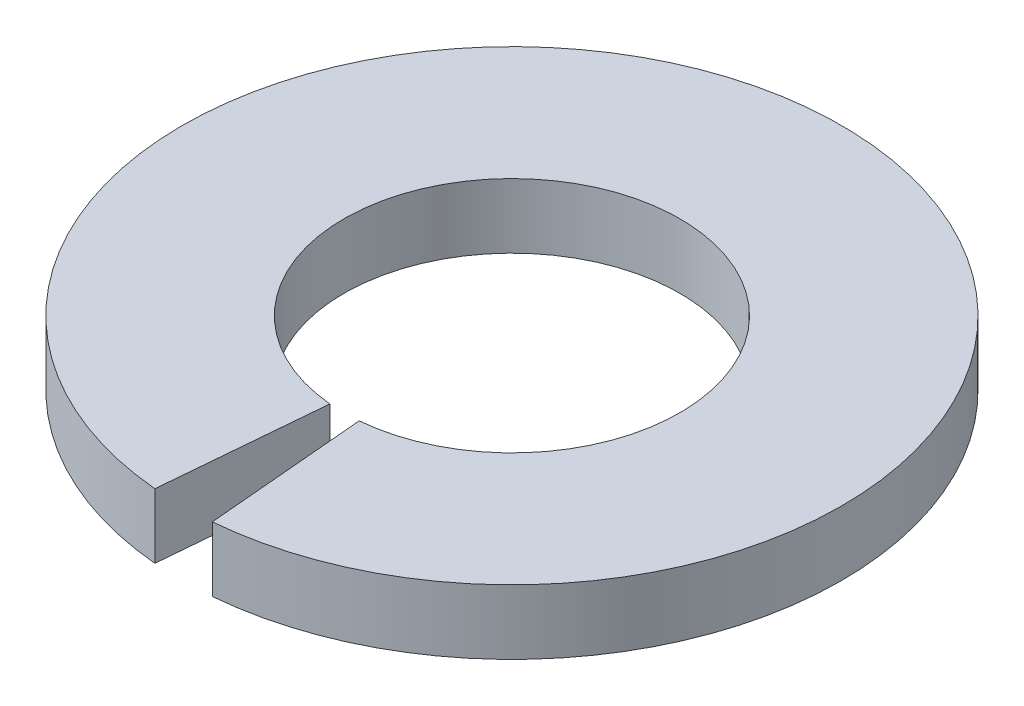
ISO-10303-21;
HEADER;
FILE_DESCRIPTION(('STEP AP214'),'2;1');
FILE_NAME('part.step','',(''),(''),'','','');
FILE_SCHEMA(('AUTOMOTIVE_DESIGN { 1 0 10303 214 1 1 1 1 }'));
ENDSEC;
DATA;
#1=APPLICATION_CONTEXT('core data for automotive mechanical design processes');
#2=APPLICATION_PROTOCOL_DEFINITION('international standard','automotive_design',2000,#1);
#3=PRODUCT_CONTEXT('',#1,'mechanical');
#4=PRODUCT('Part','Part','',(#3));
#5=PRODUCT_RELATED_PRODUCT_CATEGORY('part','',(#4));
#6=PRODUCT_DEFINITION_FORMATION('','',#4);
#7=PRODUCT_DEFINITION_CONTEXT('part definition',#1,'design');
#8=PRODUCT_DEFINITION('design','',#6,#7);
#9=PRODUCT_DEFINITION_SHAPE('','',#8);
#10=(LENGTH_UNIT() NAMED_UNIT(*) SI_UNIT(.MILLI.,.METRE.));
#11=(NAMED_UNIT(*) PLANE_ANGLE_UNIT() SI_UNIT($,.RADIAN.));
#12=(NAMED_UNIT(*) SI_UNIT($,.STERADIAN.) SOLID_ANGLE_UNIT());
#13=UNCERTAINTY_MEASURE_WITH_UNIT(LENGTH_MEASURE(1.E-05),#10,'distance_accuracy_value','');
#14=(GEOMETRIC_REPRESENTATION_CONTEXT(3) GLOBAL_UNCERTAINTY_ASSIGNED_CONTEXT((#13)) GLOBAL_UNIT_ASSIGNED_CONTEXT((#10,
#11,#12)) REPRESENTATION_CONTEXT('',''));
#15=CARTESIAN_POINT('',(0.,0.,0.));
#16=DIRECTION('',(0.,0.,1.));
#17=DIRECTION('',(1.,0.,0.));
#18=AXIS2_PLACEMENT_3D('',#15,#16,#17);
#19=CARTESIAN_POINT('',(0.,0.5,0.));
#20=DIRECTION('',(0.,1.,0.));
#21=DIRECTION('',(1.,0.,0.));
#22=AXIS2_PLACEMENT_3D('',#19,#20,#21);
#23=PLANE('',#22);
#24=CARTESIAN_POINT('',(0.,0.5,0.));
#25=DIRECTION('',(0.,-1.,0.));
#26=DIRECTION('',(-0.0871557427476639,0.,0.996194698091745));
#27=AXIS2_PLACEMENT_3D('',#24,#25,#26);
#28=CIRCLE('',#27,1.3);
#29=CARTESIAN_POINT('',(-0.113302465572,0.5,1.295053107519));
#30=VERTEX_POINT('',#29);
#31=CARTESIAN_POINT('',(0.113302465572,0.5,1.295053107519));
#32=VERTEX_POINT('',#31);
#33=EDGE_CURVE('E11',#30,#32,#28,.T.);
#34=ORIENTED_EDGE('',*,*,#33,.T.);
#35=DIRECTION('',(-0.087155742747664,0.,-0.996194698091745));
#36=VECTOR('',#35,1.);
#37=CARTESIAN_POINT('',(0.2222471440065,0.5,2.540296480134));
#38=LINE('',#37,#36);
#39=CARTESIAN_POINT('',(0.2222471440065,0.5,2.540296480134));
#40=VERTEX_POINT('',#39);
#41=EDGE_CURVE('E98',#40,#32,#38,.T.);
#42=ORIENTED_EDGE('',*,*,#41,.F.);
#43=CARTESIAN_POINT('',(0.,0.5,0.));
#44=DIRECTION('',(0.,1.,0.));
#45=DIRECTION('',(0.0871557427476639,0.,0.996194698091745));
#46=AXIS2_PLACEMENT_3D('',#43,#44,#45);
#47=CIRCLE('',#46,2.55);
#48=CARTESIAN_POINT('',(-0.2222471440065,0.5,2.540296480134));
#49=VERTEX_POINT('',#48);
#50=EDGE_CURVE('E103',#40,#49,#47,.T.);
#51=ORIENTED_EDGE('',*,*,#50,.T.);
#52=DIRECTION('',(-0.087155742747664,0.,0.996194698091745));
#53=VECTOR('',#52,1.);
#54=CARTESIAN_POINT('',(-0.113302465572,0.5,1.295053107519));
#55=LINE('',#54,#53);
#56=EDGE_CURVE('E21',#30,#49,#55,.T.);
#57=ORIENTED_EDGE('',*,*,#56,.F.);
#58=EDGE_LOOP('',(#34,#42,#51,#57));
#59=FACE_BOUND('',#58,.T.);
#60=ADVANCED_FACE('F17',(#59),#23,.T.);
#61=CARTESIAN_POINT('',(0.,0.,0.));
#62=DIRECTION('',(0.,1.,0.));
#63=DIRECTION('',(1.,0.,0.));
#64=AXIS2_PLACEMENT_3D('',#61,#62,#63);
#65=CYLINDRICAL_SURFACE('',#64,1.3);
#66=DIRECTION('',(0.,1.,0.));
#67=VECTOR('',#66,1.);
#68=CARTESIAN_POINT('',(-0.113302465572,0.,1.295053107519));
#69=LINE('',#68,#67);
#70=CARTESIAN_POINT('',(-0.113302465572,0.,1.295053107519));
#71=VERTEX_POINT('',#70);
#72=EDGE_CURVE('E66',#71,#30,#69,.T.);
#73=ORIENTED_EDGE('',*,*,#72,.F.);
#74=CARTESIAN_POINT('',(0.,0.,0.));
#75=DIRECTION('',(0.,1.,0.));
#76=DIRECTION('',(0.0871557427476639,0.,0.996194698091745));
#77=AXIS2_PLACEMENT_3D('',#74,#75,#76);
#78=CIRCLE('',#77,1.3);
#79=CARTESIAN_POINT('',(0.113302465572,0.,1.295053107519));
#80=VERTEX_POINT('',#79);
#81=EDGE_CURVE('E70',#80,#71,#78,.T.);
#82=ORIENTED_EDGE('',*,*,#81,.F.);
#83=DIRECTION('',(0.,1.,0.));
#84=VECTOR('',#83,1.);
#85=CARTESIAN_POINT('',(0.113302465572,0.,1.295053107519));
#86=LINE('',#85,#84);
#87=EDGE_CURVE('E28',#80,#32,#86,.T.);
#88=ORIENTED_EDGE('',*,*,#87,.T.);
#89=ORIENTED_EDGE('',*,*,#33,.F.);
#90=EDGE_LOOP('',(#73,#82,#88,#89));
#91=FACE_BOUND('',#90,.T.);
#92=ADVANCED_FACE('F68',(#91),#65,.F.);
#93=CARTESIAN_POINT('',(0.2222471440065,0.5,2.540296480134));
#94=DIRECTION('',(0.996194698091745,0.,-0.0871557427476639));
#95=DIRECTION('',(0.,-1.,0.));
#96=AXIS2_PLACEMENT_3D('',#93,#94,#95);
#97=PLANE('',#96);
#98=DIRECTION('',(0.,1.,0.));
#99=VECTOR('',#98,1.);
#100=CARTESIAN_POINT('',(0.2222471440065,0.,2.540296480134));
#101=LINE('',#100,#99);
#102=CARTESIAN_POINT('',(0.2222471440065,0.,2.540296480134));
#103=VERTEX_POINT('',#102);
#104=EDGE_CURVE('E99',#103,#40,#101,.T.);
#105=ORIENTED_EDGE('',*,*,#104,.T.);
#106=ORIENTED_EDGE('',*,*,#41,.T.);
#107=ORIENTED_EDGE('',*,*,#87,.F.);
#108=DIRECTION('',(-0.087155742747664,0.,-0.996194698091745));
#109=VECTOR('',#108,1.);
#110=CARTESIAN_POINT('',(0.2222471440065,0.,2.540296480134));
#111=LINE('',#110,#109);
#112=EDGE_CURVE('E87',#103,#80,#111,.T.);
#113=ORIENTED_EDGE('',*,*,#112,.F.);
#114=EDGE_LOOP('',(#105,#106,#107,#113));
#115=FACE_BOUND('',#114,.T.);
#116=ADVANCED_FACE('F116',(#115),#97,.F.);
#117=CARTESIAN_POINT('',(0.,0.,0.));
#118=DIRECTION('',(0.,1.,0.));
#119=DIRECTION('',(1.,0.,0.));
#120=AXIS2_PLACEMENT_3D('',#117,#118,#119);
#121=CYLINDRICAL_SURFACE('',#120,2.55);
#122=DIRECTION('',(0.,1.,0.));
#123=VECTOR('',#122,1.);
#124=CARTESIAN_POINT('',(-0.2222471440065,0.,2.540296480134));
#125=LINE('',#124,#123);
#126=CARTESIAN_POINT('',(-0.2222471440065,0.,2.540296480134));
#127=VERTEX_POINT('',#126);
#128=EDGE_CURVE('E80',#127,#49,#125,.T.);
#129=ORIENTED_EDGE('',*,*,#128,.T.);
#130=ORIENTED_EDGE('',*,*,#50,.F.);
#131=ORIENTED_EDGE('',*,*,#104,.F.);
#132=CARTESIAN_POINT('',(0.,0.,0.));
#133=DIRECTION('',(0.,-1.,0.));
#134=DIRECTION('',(-0.0871557427476639,0.,0.996194698091745));
#135=AXIS2_PLACEMENT_3D('',#132,#133,#134);
#136=CIRCLE('',#135,2.55);
#137=EDGE_CURVE('E93',#127,#103,#136,.T.);
#138=ORIENTED_EDGE('',*,*,#137,.F.);
#139=EDGE_LOOP('',(#129,#130,#131,#138));
#140=FACE_BOUND('',#139,.T.);
#141=ADVANCED_FACE('F112',(#140),#121,.T.);
#142=CARTESIAN_POINT('',(0.,0.5,0.));
#143=DIRECTION('',(-0.996194698091745,0.,-0.0871557427476639));
#144=DIRECTION('',(-0.0871557427476639,0.,0.996194698091745));
#145=AXIS2_PLACEMENT_3D('',#142,#143,#144);
#146=PLANE('',#145);
#147=ORIENTED_EDGE('',*,*,#72,.T.);
#148=ORIENTED_EDGE('',*,*,#56,.T.);
#149=ORIENTED_EDGE('',*,*,#128,.F.);
#150=DIRECTION('',(-0.087155742747664,0.,0.996194698091745));
#151=VECTOR('',#150,1.);
#152=CARTESIAN_POINT('',(-0.113302465572,0.,1.295053107519));
#153=LINE('',#152,#151);
#154=EDGE_CURVE('E75',#71,#127,#153,.T.);
#155=ORIENTED_EDGE('',*,*,#154,.F.);
#156=EDGE_LOOP('',(#147,#148,#149,#155));
#157=FACE_BOUND('',#156,.T.);
#158=ADVANCED_FACE('F78',(#157),#146,.F.);
#159=CARTESIAN_POINT('',(0.,0.,0.));
#160=DIRECTION('',(0.,1.,0.));
#161=DIRECTION('',(1.,0.,0.));
#162=AXIS2_PLACEMENT_3D('',#159,#160,#161);
#163=PLANE('',#162);
#164=ORIENTED_EDGE('',*,*,#137,.T.);
#165=ORIENTED_EDGE('',*,*,#112,.T.);
#166=ORIENTED_EDGE('',*,*,#81,.T.);
#167=ORIENTED_EDGE('',*,*,#154,.T.);
#168=EDGE_LOOP('',(#164,#165,#166,#167));
#169=FACE_BOUND('',#168,.T.);
#170=ADVANCED_FACE('F19',(#169),#163,.F.);
#171=CLOSED_SHELL('',(#60,#92,#116,#141,#158,#170));
#172=MANIFOLD_SOLID_BREP('B1',#171);
#173=ADVANCED_BREP_SHAPE_REPRESENTATION('',(#18,#172),#14);
#174=SHAPE_DEFINITION_REPRESENTATION(#9,#173);
ENDSEC;
END-ISO-10303-21;
